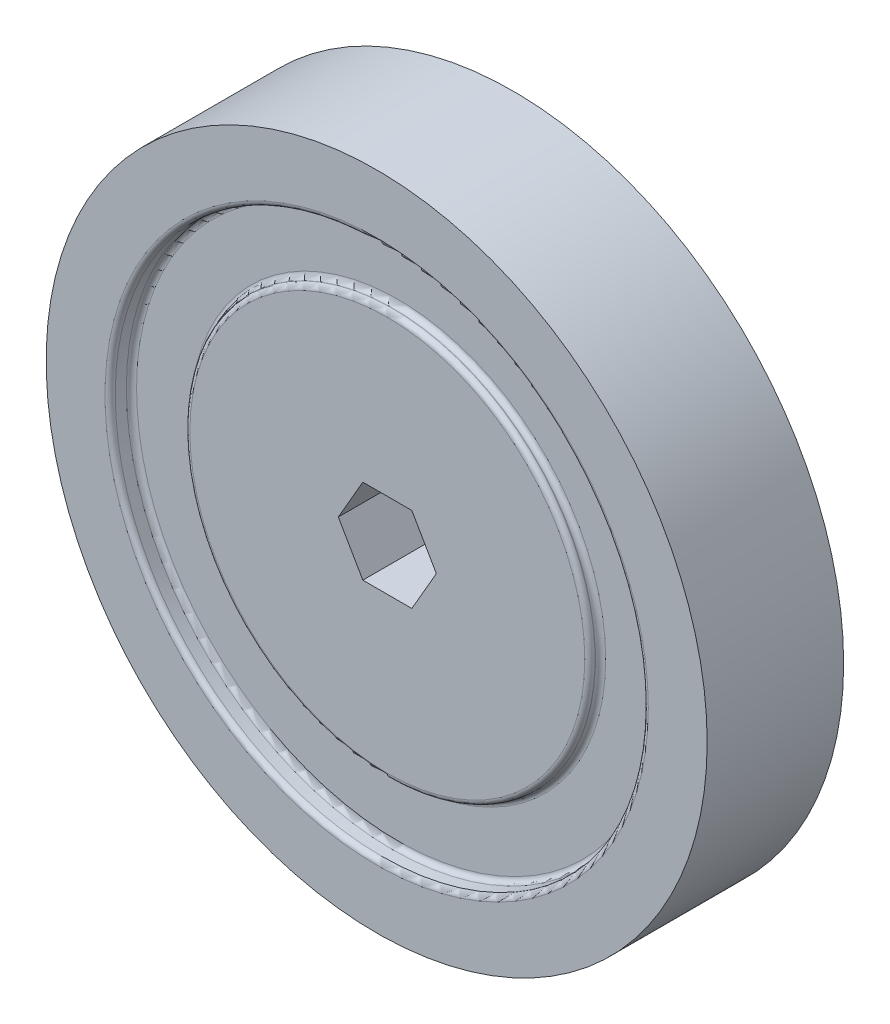
ISO-10303-21;
HEADER;
FILE_DESCRIPTION(('STEP AP214'),'2;1');
FILE_NAME('part.step','',(''),(''),'','','');
FILE_SCHEMA(('AUTOMOTIVE_DESIGN { 1 0 10303 214 1 1 1 1 }'));
ENDSEC;
DATA;
#1=APPLICATION_CONTEXT('core data for automotive mechanical design processes');
#2=APPLICATION_PROTOCOL_DEFINITION('international standard','automotive_design',2000,#1);
#3=PRODUCT_CONTEXT('',#1,'mechanical');
#4=PRODUCT('Part','Part','',(#3));
#5=PRODUCT_RELATED_PRODUCT_CATEGORY('part','',(#4));
#6=PRODUCT_DEFINITION_FORMATION('','',#4);
#7=PRODUCT_DEFINITION_CONTEXT('part definition',#1,'design');
#8=PRODUCT_DEFINITION('design','',#6,#7);
#9=PRODUCT_DEFINITION_SHAPE('','',#8);
#10=(LENGTH_UNIT() NAMED_UNIT(*) SI_UNIT(.MILLI.,.METRE.));
#11=(NAMED_UNIT(*) PLANE_ANGLE_UNIT() SI_UNIT($,.RADIAN.));
#12=(NAMED_UNIT(*) SI_UNIT($,.STERADIAN.) SOLID_ANGLE_UNIT());
#13=UNCERTAINTY_MEASURE_WITH_UNIT(LENGTH_MEASURE(1.E-05),#10,'distance_accuracy_value','');
#14=(GEOMETRIC_REPRESENTATION_CONTEXT(3) GLOBAL_UNCERTAINTY_ASSIGNED_CONTEXT((#13)) GLOBAL_UNIT_ASSIGNED_CONTEXT((#10,
#11,#12)) REPRESENTATION_CONTEXT('',''));
#15=CARTESIAN_POINT('',(0.,0.,0.));
#16=DIRECTION('',(0.,0.,1.));
#17=DIRECTION('',(1.,0.,0.));
#18=AXIS2_PLACEMENT_3D('',#15,#16,#17);
#19=CARTESIAN_POINT('',(0.,0.,-10.16));
#20=DIRECTION('',(0.,0.,1.));
#21=DIRECTION('',(1.,0.,0.));
#22=AXIS2_PLACEMENT_3D('',#19,#20,#21);
#23=CYLINDRICAL_SURFACE('',#22,49.2125);
#24=CARTESIAN_POINT('',(0.,0.,-10.16));
#25=DIRECTION('',(0.,0.,1.));
#26=DIRECTION('',(1.,0.,0.));
#27=AXIS2_PLACEMENT_3D('',#24,#25,#26);
#28=CIRCLE('',#27,49.2125);
#29=CARTESIAN_POINT('',(49.2125,0.,-10.16));
#30=VERTEX_POINT('',#29);
#31=EDGE_CURVE('E120',#30,#30,#28,.T.);
#32=ORIENTED_EDGE('',*,*,#31,.T.);
#33=EDGE_LOOP('',(#32));
#34=FACE_BOUND('',#33,.T.);
#35=CARTESIAN_POINT('',(0.,0.,10.16));
#36=DIRECTION('',(0.,0.,1.));
#37=DIRECTION('',(1.,0.,0.));
#38=AXIS2_PLACEMENT_3D('',#35,#36,#37);
#39=CIRCLE('',#38,49.2125);
#40=CARTESIAN_POINT('',(49.2125,0.,10.16));
#41=VERTEX_POINT('',#40);
#42=EDGE_CURVE('E117',#41,#41,#39,.T.);
#43=ORIENTED_EDGE('',*,*,#42,.F.);
#44=EDGE_LOOP('',(#43));
#45=FACE_BOUND('',#44,.T.);
#46=ADVANCED_FACE('F35',(#34,#45),#23,.T.);
#47=CARTESIAN_POINT('',(0.,0.,-10.16));
#48=DIRECTION('',(0.,0.,1.));
#49=DIRECTION('',(1.,0.,0.));
#50=AXIS2_PLACEMENT_3D('',#47,#48,#49);
#51=PLANE('',#50);
#52=CARTESIAN_POINT('',(0.,0.,-10.16));
#53=DIRECTION('',(0.,0.,1.));
#54=DIRECTION('',(1.,0.,0.));
#55=AXIS2_PLACEMENT_3D('',#52,#53,#54);
#56=CIRCLE('',#55,40.4495);
#57=CARTESIAN_POINT('',(40.4495,0.,-10.16));
#58=VERTEX_POINT('',#57);
#59=EDGE_CURVE('E136',#58,#58,#56,.T.);
#60=ORIENTED_EDGE('',*,*,#59,.T.);
#61=EDGE_LOOP('',(#60));
#62=FACE_BOUND('',#61,.T.);
#63=ORIENTED_EDGE('',*,*,#31,.F.);
#64=EDGE_LOOP('',(#63));
#65=FACE_BOUND('',#64,.T.);
#66=ADVANCED_FACE('F185',(#62,#65),#51,.F.);
#67=CARTESIAN_POINT('',(0.,0.,10.16));
#68=DIRECTION('',(0.,0.,1.));
#69=DIRECTION('',(1.,0.,0.));
#70=AXIS2_PLACEMENT_3D('',#67,#68,#69);
#71=PLANE('',#70);
#72=CARTESIAN_POINT('',(0.,0.,10.16));
#73=DIRECTION('',(0.,0.,1.));
#74=DIRECTION('',(1.,0.,0.));
#75=AXIS2_PLACEMENT_3D('',#72,#73,#74);
#76=CIRCLE('',#75,40.4495);
#77=CARTESIAN_POINT('',(40.4495,0.,10.16));
#78=VERTEX_POINT('',#77);
#79=EDGE_CURVE('E94',#78,#78,#76,.F.);
#80=ORIENTED_EDGE('',*,*,#79,.T.);
#81=EDGE_LOOP('',(#80));
#82=FACE_BOUND('',#81,.T.);
#83=ORIENTED_EDGE('',*,*,#42,.T.);
#84=EDGE_LOOP('',(#83));
#85=FACE_BOUND('',#84,.T.);
#86=ADVANCED_FACE('F191',(#82,#85),#71,.T.);
#87=CARTESIAN_POINT('',(7.29770740255687,0.,-10.16));
#88=DIRECTION('',(0.866025403784438,0.5,0.));
#89=DIRECTION('',(-0.5,0.866025403784438,0.));
#90=AXIS2_PLACEMENT_3D('',#87,#88,#89);
#91=PLANE('',#90);
#92=DIRECTION('',(0.,0.,1.));
#93=VECTOR('',#92,1.);
#94=CARTESIAN_POINT('',(7.29770740255687,0.,-10.16));
#95=LINE('',#94,#93);
#96=CARTESIAN_POINT('',(7.29770740255687,0.,-8.5725));
#97=VERTEX_POINT('',#96);
#98=CARTESIAN_POINT('',(7.29770740255687,0.,8.5725));
#99=VERTEX_POINT('',#98);
#100=EDGE_CURVE('E103',#97,#99,#95,.T.);
#101=ORIENTED_EDGE('',*,*,#100,.T.);
#102=DIRECTION('',(-0.5,0.866025403784438,0.));
#103=VECTOR('',#102,1.);
#104=CARTESIAN_POINT('',(7.29770740255687,0.,8.5725));
#105=LINE('',#104,#103);
#106=CARTESIAN_POINT('',(3.64885370127844,6.32,8.5725));
#107=VERTEX_POINT('',#106);
#108=EDGE_CURVE('E88',#99,#107,#105,.T.);
#109=ORIENTED_EDGE('',*,*,#108,.T.);
#110=DIRECTION('',(0.,0.,1.));
#111=VECTOR('',#110,1.);
#112=CARTESIAN_POINT('',(3.64885370127844,6.32,-10.16));
#113=LINE('',#112,#111);
#114=CARTESIAN_POINT('',(3.64885370127844,6.32,-8.5725));
#115=VERTEX_POINT('',#114);
#116=EDGE_CURVE('E101',#115,#107,#113,.T.);
#117=ORIENTED_EDGE('',*,*,#116,.F.);
#118=DIRECTION('',(0.5,-0.866025403784438,0.));
#119=VECTOR('',#118,1.);
#120=CARTESIAN_POINT('',(7.29770740255687,0.,-8.5725));
#121=LINE('',#120,#119);
#122=EDGE_CURVE('E58',#115,#97,#121,.T.);
#123=ORIENTED_EDGE('',*,*,#122,.T.);
#124=EDGE_LOOP('',(#101,#109,#117,#123));
#125=FACE_BOUND('',#124,.T.);
#126=ADVANCED_FACE('F100',(#125),#91,.F.);
#127=CARTESIAN_POINT('',(3.64885370127844,-6.32,-10.16));
#128=DIRECTION('',(0.866025403784439,-0.5,0.));
#129=DIRECTION('',(0.5,0.866025403784439,0.));
#130=AXIS2_PLACEMENT_3D('',#127,#128,#129);
#131=PLANE('',#130);
#132=DIRECTION('',(0.,0.,1.));
#133=VECTOR('',#132,1.);
#134=CARTESIAN_POINT('',(3.64885370127844,-6.32,-10.16));
#135=LINE('',#134,#133);
#136=CARTESIAN_POINT('',(3.64885370127844,-6.32,-8.5725));
#137=VERTEX_POINT('',#136);
#138=CARTESIAN_POINT('',(3.64885370127844,-6.32,8.5725));
#139=VERTEX_POINT('',#138);
#140=EDGE_CURVE('E410',#137,#139,#135,.T.);
#141=ORIENTED_EDGE('',*,*,#140,.T.);
#142=DIRECTION('',(0.5,0.866025403784439,0.));
#143=VECTOR('',#142,1.);
#144=CARTESIAN_POINT('',(3.64885370127844,-6.32,8.5725));
#145=LINE('',#144,#143);
#146=EDGE_CURVE('E105',#139,#99,#145,.T.);
#147=ORIENTED_EDGE('',*,*,#146,.T.);
#148=ORIENTED_EDGE('',*,*,#100,.F.);
#149=DIRECTION('',(-0.5,-0.866025403784439,0.));
#150=VECTOR('',#149,1.);
#151=CARTESIAN_POINT('',(3.64885370127844,-6.32,-8.5725));
#152=LINE('',#151,#150);
#153=EDGE_CURVE('E113',#97,#137,#152,.T.);
#154=ORIENTED_EDGE('',*,*,#153,.T.);
#155=EDGE_LOOP('',(#141,#147,#148,#154));
#156=FACE_BOUND('',#155,.T.);
#157=ADVANCED_FACE('F350',(#156),#131,.F.);
#158=CARTESIAN_POINT('',(-3.64885370127843,-6.32,-10.16));
#159=DIRECTION('',(0.,-1.,0.));
#160=DIRECTION('',(1.,0.,0.));
#161=AXIS2_PLACEMENT_3D('',#158,#159,#160);
#162=PLANE('',#161);
#163=DIRECTION('',(0.,0.,1.));
#164=VECTOR('',#163,1.);
#165=CARTESIAN_POINT('',(-3.64885370127843,-6.32,-10.16));
#166=LINE('',#165,#164);
#167=CARTESIAN_POINT('',(-3.64885370127843,-6.32,-8.5725));
#168=VERTEX_POINT('',#167);
#169=CARTESIAN_POINT('',(-3.64885370127843,-6.32,8.5725));
#170=VERTEX_POINT('',#169);
#171=EDGE_CURVE('E413',#168,#170,#166,.T.);
#172=ORIENTED_EDGE('',*,*,#171,.T.);
#173=DIRECTION('',(1.,0.,0.));
#174=VECTOR('',#173,1.);
#175=CARTESIAN_POINT('',(-3.64885370127843,-6.32,8.5725));
#176=LINE('',#175,#174);
#177=EDGE_CURVE('E428',#170,#139,#176,.T.);
#178=ORIENTED_EDGE('',*,*,#177,.T.);
#179=ORIENTED_EDGE('',*,*,#140,.F.);
#180=DIRECTION('',(-1.,0.,0.));
#181=VECTOR('',#180,1.);
#182=CARTESIAN_POINT('',(-3.64885370127843,-6.32,-8.5725));
#183=LINE('',#182,#181);
#184=EDGE_CURVE('E437',#137,#168,#183,.T.);
#185=ORIENTED_EDGE('',*,*,#184,.T.);
#186=EDGE_LOOP('',(#172,#178,#179,#185));
#187=FACE_BOUND('',#186,.T.);
#188=ADVANCED_FACE('F341',(#187),#162,.F.);
#189=CARTESIAN_POINT('',(-7.29770740255687,0.,-10.16));
#190=DIRECTION('',(-0.866025403784439,-0.5,0.));
#191=DIRECTION('',(0.5,-0.866025403784439,0.));
#192=AXIS2_PLACEMENT_3D('',#189,#190,#191);
#193=PLANE('',#192);
#194=DIRECTION('',(0.,0.,1.));
#195=VECTOR('',#194,1.);
#196=CARTESIAN_POINT('',(-7.29770740255687,0.,-10.16));
#197=LINE('',#196,#195);
#198=CARTESIAN_POINT('',(-7.29770740255687,0.,-8.5725));
#199=VERTEX_POINT('',#198);
#200=CARTESIAN_POINT('',(-7.29770740255687,0.,8.5725));
#201=VERTEX_POINT('',#200);
#202=EDGE_CURVE('E111',#199,#201,#197,.T.);
#203=ORIENTED_EDGE('',*,*,#202,.T.);
#204=DIRECTION('',(0.5,-0.866025403784439,0.));
#205=VECTOR('',#204,1.);
#206=CARTESIAN_POINT('',(-7.29770740255687,0.,8.5725));
#207=LINE('',#206,#205);
#208=EDGE_CURVE('E423',#201,#170,#207,.T.);
#209=ORIENTED_EDGE('',*,*,#208,.T.);
#210=ORIENTED_EDGE('',*,*,#171,.F.);
#211=DIRECTION('',(-0.5,0.866025403784439,0.));
#212=VECTOR('',#211,1.);
#213=CARTESIAN_POINT('',(-7.29770740255687,0.,-8.5725));
#214=LINE('',#213,#212);
#215=EDGE_CURVE('E424',#168,#199,#214,.T.);
#216=ORIENTED_EDGE('',*,*,#215,.T.);
#217=EDGE_LOOP('',(#203,#209,#210,#216));
#218=FACE_BOUND('',#217,.T.);
#219=ADVANCED_FACE('F332',(#218),#193,.F.);
#220=CARTESIAN_POINT('',(-3.64885370127843,6.32,-10.16));
#221=DIRECTION('',(-0.866025403784439,0.5,0.));
#222=DIRECTION('',(-0.5,-0.866025403784439,0.));
#223=AXIS2_PLACEMENT_3D('',#220,#221,#222);
#224=PLANE('',#223);
#225=DIRECTION('',(0.,0.,1.));
#226=VECTOR('',#225,1.);
#227=CARTESIAN_POINT('',(-3.64885370127843,6.32,-10.16));
#228=LINE('',#227,#226);
#229=CARTESIAN_POINT('',(-3.64885370127844,6.32,-8.5725));
#230=VERTEX_POINT('',#229);
#231=CARTESIAN_POINT('',(-3.64885370127843,6.32,8.5725));
#232=VERTEX_POINT('',#231);
#233=EDGE_CURVE('E109',#230,#232,#228,.T.);
#234=ORIENTED_EDGE('',*,*,#233,.T.);
#235=DIRECTION('',(-0.5,-0.866025403784439,0.));
#236=VECTOR('',#235,1.);
#237=CARTESIAN_POINT('',(-3.64885370127843,6.32,8.5725));
#238=LINE('',#237,#236);
#239=EDGE_CURVE('E50',#232,#201,#238,.T.);
#240=ORIENTED_EDGE('',*,*,#239,.T.);
#241=ORIENTED_EDGE('',*,*,#202,.F.);
#242=DIRECTION('',(0.5,0.866025403784439,0.));
#243=VECTOR('',#242,1.);
#244=CARTESIAN_POINT('',(-3.64885370127843,6.32,-8.5725));
#245=LINE('',#244,#243);
#246=EDGE_CURVE('E426',#199,#230,#245,.T.);
#247=ORIENTED_EDGE('',*,*,#246,.T.);
#248=EDGE_LOOP('',(#234,#240,#241,#247));
#249=FACE_BOUND('',#248,.T.);
#250=ADVANCED_FACE('F324',(#249),#224,.F.);
#251=CARTESIAN_POINT('',(3.64885370127844,6.32,-10.16));
#252=DIRECTION('',(0.,1.,0.));
#253=DIRECTION('',(-1.,0.,0.));
#254=AXIS2_PLACEMENT_3D('',#251,#252,#253);
#255=PLANE('',#254);
#256=ORIENTED_EDGE('',*,*,#116,.T.);
#257=DIRECTION('',(-1.,0.,0.));
#258=VECTOR('',#257,1.);
#259=CARTESIAN_POINT('',(3.64885370127844,6.32,8.5725));
#260=LINE('',#259,#258);
#261=EDGE_CURVE('E85',#107,#232,#260,.T.);
#262=ORIENTED_EDGE('',*,*,#261,.T.);
#263=ORIENTED_EDGE('',*,*,#233,.F.);
#264=DIRECTION('',(1.,0.,0.));
#265=VECTOR('',#264,1.);
#266=CARTESIAN_POINT('',(3.64885370127844,6.32,-8.5725));
#267=LINE('',#266,#265);
#268=EDGE_CURVE('E108',#230,#115,#267,.T.);
#269=ORIENTED_EDGE('',*,*,#268,.T.);
#270=EDGE_LOOP('',(#256,#262,#263,#269));
#271=FACE_BOUND('',#270,.T.);
#272=ADVANCED_FACE('F107',(#271),#255,.F.);
#273=CARTESIAN_POINT('',(0.,0.,-8.5725));
#274=DIRECTION('',(0.,0.,1.));
#275=DIRECTION('',(1.,0.,0.));
#276=AXIS2_PLACEMENT_3D('',#273,#274,#275);
#277=PLANE('',#276);
#278=CARTESIAN_POINT('',(0.,0.,-8.5725));
#279=DIRECTION('',(0.,0.,1.));
#280=DIRECTION('',(1.,0.,0.));
#281=AXIS2_PLACEMENT_3D('',#278,#279,#280);
#282=CIRCLE('',#281,29.4005);
#283=CARTESIAN_POINT('',(29.4005,0.,-8.5725));
#284=VERTEX_POINT('',#283);
#285=EDGE_CURVE('E95',#284,#284,#282,.F.);
#286=ORIENTED_EDGE('',*,*,#285,.T.);
#287=EDGE_LOOP('',(#286));
#288=FACE_BOUND('',#287,.T.);
#289=ORIENTED_EDGE('',*,*,#268,.F.);
#290=ORIENTED_EDGE('',*,*,#246,.F.);
#291=ORIENTED_EDGE('',*,*,#215,.F.);
#292=ORIENTED_EDGE('',*,*,#184,.F.);
#293=ORIENTED_EDGE('',*,*,#153,.F.);
#294=ORIENTED_EDGE('',*,*,#122,.F.);
#295=EDGE_LOOP('',(#289,#290,#291,#292,#293,#294));
#296=FACE_BOUND('',#295,.T.);
#297=ADVANCED_FACE('F306',(#288,#296),#277,.F.);
#298=CARTESIAN_POINT('',(0.,30.1625,-6.985));
#299=DIRECTION('',(0.,0.,1.));
#300=DIRECTION('',(1.,0.,0.));
#301=AXIS2_PLACEMENT_3D('',#298,#299,#300);
#302=PLANE('',#301);
#303=CARTESIAN_POINT('',(0.,0.,-6.985));
#304=DIRECTION('',(0.,0.,1.));
#305=DIRECTION('',(1.,0.,0.));
#306=AXIS2_PLACEMENT_3D('',#303,#304,#305);
#307=CIRCLE('',#306,30.9245);
#308=CARTESIAN_POINT('',(30.9245,0.,-6.985));
#309=VERTEX_POINT('',#308);
#310=EDGE_CURVE('E130',#309,#309,#307,.T.);
#311=ORIENTED_EDGE('',*,*,#310,.T.);
#312=EDGE_LOOP('',(#311));
#313=FACE_BOUND('',#312,.T.);
#314=CARTESIAN_POINT('',(0.,0.,-6.985));
#315=DIRECTION('',(0.,0.,-1.));
#316=DIRECTION('',(-1.,0.,0.));
#317=AXIS2_PLACEMENT_3D('',#314,#315,#316);
#318=CIRCLE('',#317,39.6875);
#319=CARTESIAN_POINT('',(-39.6875,0.,-6.985));
#320=VERTEX_POINT('',#319);
#321=EDGE_CURVE('E104',#320,#320,#318,.T.);
#322=ORIENTED_EDGE('',*,*,#321,.T.);
#323=EDGE_LOOP('',(#322));
#324=FACE_BOUND('',#323,.T.);
#325=ADVANCED_FACE('F297',(#313,#324),#302,.F.);
#326=CARTESIAN_POINT('',(0.,0.,-22.7530353955303));
#327=DIRECTION('',(0.,0.,-1.));
#328=DIRECTION('',(-1.,0.,0.));
#329=AXIS2_PLACEMENT_3D('',#326,#327,#328);
#330=CYLINDRICAL_SURFACE('',#329,39.6875);
#331=CARTESIAN_POINT('',(0.,0.,-9.398));
#332=DIRECTION('',(0.,0.,1.));
#333=DIRECTION('',(1.,0.,0.));
#334=AXIS2_PLACEMENT_3D('',#331,#332,#333);
#335=CIRCLE('',#334,39.6875);
#336=CARTESIAN_POINT('',(39.6875,0.,-9.398));
#337=VERTEX_POINT('',#336);
#338=EDGE_CURVE('E133',#337,#337,#335,.F.);
#339=ORIENTED_EDGE('',*,*,#338,.T.);
#340=EDGE_LOOP('',(#339));
#341=FACE_BOUND('',#340,.T.);
#342=ORIENTED_EDGE('',*,*,#321,.F.);
#343=EDGE_LOOP('',(#342));
#344=FACE_BOUND('',#343,.T.);
#345=ADVANCED_FACE('F289',(#341,#344),#330,.F.);
#346=CARTESIAN_POINT('',(0.,0.,-22.7530353955303));
#347=DIRECTION('',(0.,0.,-1.));
#348=DIRECTION('',(-1.,0.,0.));
#349=AXIS2_PLACEMENT_3D('',#346,#347,#348);
#350=CYLINDRICAL_SURFACE('',#349,30.1625);
#351=CARTESIAN_POINT('',(0.,0.,-7.747));
#352=DIRECTION('',(0.,0.,1.));
#353=DIRECTION('',(1.,0.,0.));
#354=AXIS2_PLACEMENT_3D('',#351,#352,#353);
#355=CIRCLE('',#354,30.1625);
#356=CARTESIAN_POINT('',(30.1625,0.,-7.747));
#357=VERTEX_POINT('',#356);
#358=EDGE_CURVE('E127',#357,#357,#355,.F.);
#359=ORIENTED_EDGE('',*,*,#358,.T.);
#360=EDGE_LOOP('',(#359));
#361=FACE_BOUND('',#360,.T.);
#362=CARTESIAN_POINT('',(0.,0.,-7.8105));
#363=DIRECTION('',(0.,0.,1.));
#364=DIRECTION('',(1.,0.,0.));
#365=AXIS2_PLACEMENT_3D('',#362,#363,#364);
#366=CIRCLE('',#365,30.1625);
#367=CARTESIAN_POINT('',(30.1625,0.,-7.8105));
#368=VERTEX_POINT('',#367);
#369=EDGE_CURVE('E124',#368,#368,#366,.T.);
#370=ORIENTED_EDGE('',*,*,#369,.T.);
#371=EDGE_LOOP('',(#370));
#372=FACE_BOUND('',#371,.T.);
#373=ADVANCED_FACE('F201',(#361,#372),#350,.T.);
#374=CARTESIAN_POINT('',(0.,0.,-7.747));
#375=DIRECTION('',(0.,0.,1.));
#376=DIRECTION('',(1.,0.,0.));
#377=AXIS2_PLACEMENT_3D('',#374,#375,#376);
#378=TOROIDAL_SURFACE('',#377,30.9245,0.762);
#379=ORIENTED_EDGE('',*,*,#310,.F.);
#380=EDGE_LOOP('',(#379));
#381=FACE_BOUND('',#380,.T.);
#382=ORIENTED_EDGE('',*,*,#358,.F.);
#383=EDGE_LOOP('',(#382));
#384=FACE_BOUND('',#383,.T.);
#385=ADVANCED_FACE('F197',(#381,#384),#378,.F.);
#386=CARTESIAN_POINT('',(0.,0.,-9.398));
#387=DIRECTION('',(0.,0.,1.));
#388=DIRECTION('',(1.,0.,0.));
#389=AXIS2_PLACEMENT_3D('',#386,#387,#388);
#390=TOROIDAL_SURFACE('',#389,40.4495,0.762);
#391=ORIENTED_EDGE('',*,*,#59,.F.);
#392=EDGE_LOOP('',(#391));
#393=FACE_BOUND('',#392,.T.);
#394=ORIENTED_EDGE('',*,*,#338,.F.);
#395=EDGE_LOOP('',(#394));
#396=FACE_BOUND('',#395,.T.);
#397=ADVANCED_FACE('F200',(#393,#396),#390,.T.);
#398=CARTESIAN_POINT('',(0.,0.,-7.8105));
#399=DIRECTION('',(0.,0.,1.));
#400=DIRECTION('',(1.,0.,0.));
#401=AXIS2_PLACEMENT_3D('',#398,#399,#400);
#402=TOROIDAL_SURFACE('',#401,29.4005,0.762);
#403=ORIENTED_EDGE('',*,*,#369,.F.);
#404=EDGE_LOOP('',(#403));
#405=FACE_BOUND('',#404,.T.);
#406=ORIENTED_EDGE('',*,*,#285,.F.);
#407=EDGE_LOOP('',(#406));
#408=FACE_BOUND('',#407,.T.);
#409=ADVANCED_FACE('F180',(#405,#408),#402,.T.);
#410=CARTESIAN_POINT('',(0.,0.,8.5725));
#411=DIRECTION('',(0.,0.,-1.));
#412=DIRECTION('',(1.,0.,0.));
#413=AXIS2_PLACEMENT_3D('',#410,#411,#412);
#414=PLANE('',#413);
#415=CARTESIAN_POINT('',(0.,0.,8.5725));
#416=DIRECTION('',(0.,0.,-1.));
#417=DIRECTION('',(-1.,0.,0.));
#418=AXIS2_PLACEMENT_3D('',#415,#416,#417);
#419=CIRCLE('',#418,29.4005);
#420=CARTESIAN_POINT('',(-29.4005,0.,8.5725));
#421=VERTEX_POINT('',#420);
#422=EDGE_CURVE('E11',#421,#421,#419,.F.);
#423=ORIENTED_EDGE('',*,*,#422,.T.);
#424=EDGE_LOOP('',(#423));
#425=FACE_BOUND('',#424,.T.);
#426=ORIENTED_EDGE('',*,*,#146,.F.);
#427=ORIENTED_EDGE('',*,*,#177,.F.);
#428=ORIENTED_EDGE('',*,*,#208,.F.);
#429=ORIENTED_EDGE('',*,*,#239,.F.);
#430=ORIENTED_EDGE('',*,*,#261,.F.);
#431=ORIENTED_EDGE('',*,*,#108,.F.);
#432=EDGE_LOOP('',(#426,#427,#428,#429,#430,#431));
#433=FACE_BOUND('',#432,.T.);
#434=ADVANCED_FACE('F87',(#425,#433),#414,.F.);
#435=CARTESIAN_POINT('',(0.,30.1625,6.985));
#436=DIRECTION('',(0.,0.,-1.));
#437=DIRECTION('',(1.,0.,0.));
#438=AXIS2_PLACEMENT_3D('',#435,#436,#437);
#439=PLANE('',#438);
#440=CARTESIAN_POINT('',(0.,0.,6.985));
#441=DIRECTION('',(0.,0.,-1.));
#442=DIRECTION('',(-1.,0.,0.));
#443=AXIS2_PLACEMENT_3D('',#440,#441,#442);
#444=CIRCLE('',#443,38.9255);
#445=CARTESIAN_POINT('',(-38.9255,0.,6.985));
#446=VERTEX_POINT('',#445);
#447=EDGE_CURVE('E152',#446,#446,#444,.F.);
#448=ORIENTED_EDGE('',*,*,#447,.T.);
#449=EDGE_LOOP('',(#448));
#450=FACE_BOUND('',#449,.T.);
#451=CARTESIAN_POINT('',(0.,0.,6.985));
#452=DIRECTION('',(0.,0.,-1.));
#453=DIRECTION('',(-1.,0.,0.));
#454=AXIS2_PLACEMENT_3D('',#451,#452,#453);
#455=CIRCLE('',#454,30.9245);
#456=CARTESIAN_POINT('',(-30.9245,0.,6.985));
#457=VERTEX_POINT('',#456);
#458=EDGE_CURVE('E149',#457,#457,#455,.T.);
#459=ORIENTED_EDGE('',*,*,#458,.T.);
#460=EDGE_LOOP('',(#459));
#461=FACE_BOUND('',#460,.T.);
#462=ADVANCED_FACE('F169',(#450,#461),#439,.F.);
#463=CARTESIAN_POINT('',(0.,0.,22.7530353955303));
#464=DIRECTION('',(0.,0.,1.));
#465=DIRECTION('',(-1.,0.,0.));
#466=AXIS2_PLACEMENT_3D('',#463,#464,#465);
#467=CYLINDRICAL_SURFACE('',#466,39.6875);
#468=CARTESIAN_POINT('',(0.,0.,9.398));
#469=DIRECTION('',(0.,0.,1.));
#470=DIRECTION('',(1.,0.,0.));
#471=AXIS2_PLACEMENT_3D('',#468,#469,#470);
#472=CIRCLE('',#471,39.6875);
#473=CARTESIAN_POINT('',(39.6875,0.,9.398));
#474=VERTEX_POINT('',#473);
#475=EDGE_CURVE('E146',#474,#474,#472,.T.);
#476=ORIENTED_EDGE('',*,*,#475,.T.);
#477=EDGE_LOOP('',(#476));
#478=FACE_BOUND('',#477,.T.);
#479=CARTESIAN_POINT('',(0.,0.,7.747));
#480=DIRECTION('',(0.,0.,-1.));
#481=DIRECTION('',(-1.,0.,0.));
#482=AXIS2_PLACEMENT_3D('',#479,#480,#481);
#483=CIRCLE('',#482,39.6875);
#484=CARTESIAN_POINT('',(-39.6875,0.,7.747));
#485=VERTEX_POINT('',#484);
#486=EDGE_CURVE('E143',#485,#485,#483,.T.);
#487=ORIENTED_EDGE('',*,*,#486,.T.);
#488=EDGE_LOOP('',(#487));
#489=FACE_BOUND('',#488,.T.);
#490=ADVANCED_FACE('F171',(#478,#489),#467,.F.);
#491=CARTESIAN_POINT('',(0.,0.,22.7530353955303));
#492=DIRECTION('',(0.,0.,1.));
#493=DIRECTION('',(-1.,0.,0.));
#494=AXIS2_PLACEMENT_3D('',#491,#492,#493);
#495=CYLINDRICAL_SURFACE('',#494,30.1625);
#496=CARTESIAN_POINT('',(0.,0.,7.747));
#497=DIRECTION('',(0.,0.,-1.));
#498=DIRECTION('',(-1.,0.,0.));
#499=AXIS2_PLACEMENT_3D('',#496,#497,#498);
#500=CIRCLE('',#499,30.1625);
#501=CARTESIAN_POINT('',(-30.1625,0.,7.747));
#502=VERTEX_POINT('',#501);
#503=EDGE_CURVE('E43',#502,#502,#500,.F.);
#504=ORIENTED_EDGE('',*,*,#503,.T.);
#505=EDGE_LOOP('',(#504));
#506=FACE_BOUND('',#505,.T.);
#507=CARTESIAN_POINT('',(0.,0.,7.8105));
#508=DIRECTION('',(0.,0.,-1.));
#509=DIRECTION('',(-1.,0.,0.));
#510=AXIS2_PLACEMENT_3D('',#507,#508,#509);
#511=CIRCLE('',#510,30.1625);
#512=CARTESIAN_POINT('',(-30.1625,0.,7.8105));
#513=VERTEX_POINT('',#512);
#514=EDGE_CURVE('E155',#513,#513,#511,.T.);
#515=ORIENTED_EDGE('',*,*,#514,.T.);
#516=EDGE_LOOP('',(#515));
#517=FACE_BOUND('',#516,.T.);
#518=ADVANCED_FACE('F160',(#506,#517),#495,.T.);
#519=CARTESIAN_POINT('',(0.,0.,9.398));
#520=DIRECTION('',(0.,0.,1.));
#521=DIRECTION('',(1.,0.,0.));
#522=AXIS2_PLACEMENT_3D('',#519,#520,#521);
#523=TOROIDAL_SURFACE('',#522,40.4495,0.762);
#524=ORIENTED_EDGE('',*,*,#475,.F.);
#525=EDGE_LOOP('',(#524));
#526=FACE_BOUND('',#525,.T.);
#527=ORIENTED_EDGE('',*,*,#79,.F.);
#528=EDGE_LOOP('',(#527));
#529=FACE_BOUND('',#528,.T.);
#530=ADVANCED_FACE('F209',(#526,#529),#523,.T.);
#531=CARTESIAN_POINT('',(0.,0.,7.747));
#532=DIRECTION('',(0.,0.,-1.));
#533=DIRECTION('',(-1.,0.,0.));
#534=AXIS2_PLACEMENT_3D('',#531,#532,#533);
#535=TOROIDAL_SURFACE('',#534,38.9255,0.762);
#536=ORIENTED_EDGE('',*,*,#447,.F.);
#537=EDGE_LOOP('',(#536));
#538=FACE_BOUND('',#537,.T.);
#539=ORIENTED_EDGE('',*,*,#486,.F.);
#540=EDGE_LOOP('',(#539));
#541=FACE_BOUND('',#540,.T.);
#542=ADVANCED_FACE('F166',(#538,#541),#535,.F.);
#543=CARTESIAN_POINT('',(0.,0.,7.747));
#544=DIRECTION('',(0.,0.,-1.));
#545=DIRECTION('',(-1.,0.,0.));
#546=AXIS2_PLACEMENT_3D('',#543,#544,#545);
#547=TOROIDAL_SURFACE('',#546,30.9245,0.762);
#548=ORIENTED_EDGE('',*,*,#503,.F.);
#549=EDGE_LOOP('',(#548));
#550=FACE_BOUND('',#549,.T.);
#551=ORIENTED_EDGE('',*,*,#458,.F.);
#552=EDGE_LOOP('',(#551));
#553=FACE_BOUND('',#552,.T.);
#554=ADVANCED_FACE('F163',(#550,#553),#547,.F.);
#555=CARTESIAN_POINT('',(0.,0.,7.8105));
#556=DIRECTION('',(0.,0.,-1.));
#557=DIRECTION('',(-1.,0.,0.));
#558=AXIS2_PLACEMENT_3D('',#555,#556,#557);
#559=TOROIDAL_SURFACE('',#558,29.4005,0.762);
#560=ORIENTED_EDGE('',*,*,#422,.F.);
#561=EDGE_LOOP('',(#560));
#562=FACE_BOUND('',#561,.T.);
#563=ORIENTED_EDGE('',*,*,#514,.F.);
#564=EDGE_LOOP('',(#563));
#565=FACE_BOUND('',#564,.T.);
#566=ADVANCED_FACE('F37',(#562,#565),#559,.T.);
#567=CLOSED_SHELL('',(#46,#66,#86,#126,#157,#188,#219,#250,#272,#297,#325,#345,#373,#385,#397,
#409,#434,#462,#490,#518,#530,#542,#554,#566));
#568=MANIFOLD_SOLID_BREP('B2',#567);
#569=ADVANCED_BREP_SHAPE_REPRESENTATION('',(#18,#568),#14);
#570=SHAPE_DEFINITION_REPRESENTATION(#9,#569);
ENDSEC;
END-ISO-10303-21;
